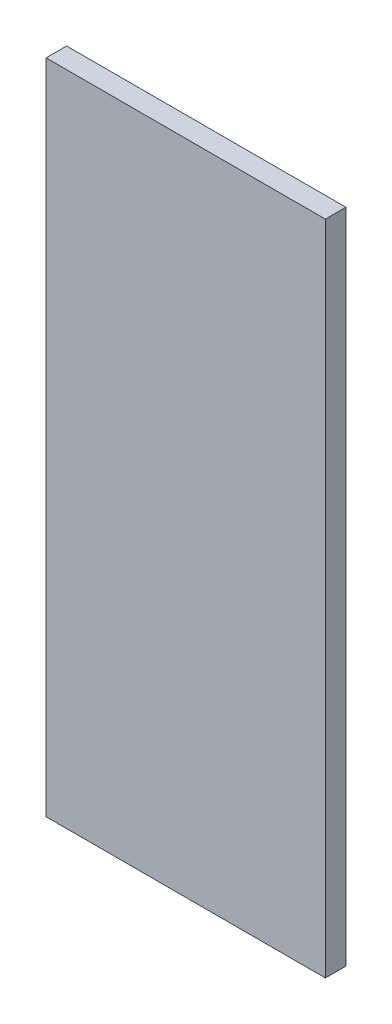
ISO-10303-21;
HEADER;
FILE_DESCRIPTION(('STEP AP214'),'2;1');
FILE_NAME('part.step','',(''),(''),'','','');
FILE_SCHEMA(('AUTOMOTIVE_DESIGN { 1 0 10303 214 1 1 1 1 }'));
ENDSEC;
DATA;
#1=APPLICATION_CONTEXT('core data for automotive mechanical design processes');
#2=APPLICATION_PROTOCOL_DEFINITION('international standard','automotive_design',2000,#1);
#3=PRODUCT_CONTEXT('',#1,'mechanical');
#4=PRODUCT('Part','Part','',(#3));
#5=PRODUCT_RELATED_PRODUCT_CATEGORY('part','',(#4));
#6=PRODUCT_DEFINITION_FORMATION('','',#4);
#7=PRODUCT_DEFINITION_CONTEXT('part definition',#1,'design');
#8=PRODUCT_DEFINITION('design','',#6,#7);
#9=PRODUCT_DEFINITION_SHAPE('','',#8);
#10=(LENGTH_UNIT() NAMED_UNIT(*) SI_UNIT(.MILLI.,.METRE.));
#11=(NAMED_UNIT(*) PLANE_ANGLE_UNIT() SI_UNIT($,.RADIAN.));
#12=(NAMED_UNIT(*) SI_UNIT($,.STERADIAN.) SOLID_ANGLE_UNIT());
#13=UNCERTAINTY_MEASURE_WITH_UNIT(LENGTH_MEASURE(1.E-05),#10,'distance_accuracy_value','');
#14=(GEOMETRIC_REPRESENTATION_CONTEXT(3) GLOBAL_UNCERTAINTY_ASSIGNED_CONTEXT((#13)) GLOBAL_UNIT_ASSIGNED_CONTEXT((#10,
#11,#12)) REPRESENTATION_CONTEXT('',''));
#15=CARTESIAN_POINT('',(0.,0.,0.));
#16=DIRECTION('',(0.,0.,1.));
#17=DIRECTION('',(1.,0.,0.));
#18=AXIS2_PLACEMENT_3D('',#15,#16,#17);
#19=CARTESIAN_POINT('',(10.795,25.4,1.5875));
#20=DIRECTION('',(-1.,0.,0.));
#21=DIRECTION('',(0.,-1.,0.));
#22=AXIS2_PLACEMENT_3D('',#19,#20,#21);
#23=PLANE('',#22);
#24=DIRECTION('',(0.,1.,0.));
#25=VECTOR('',#24,1.);
#26=CARTESIAN_POINT('',(10.795,25.4,0.));
#27=LINE('',#26,#25);
#28=CARTESIAN_POINT('',(10.795,-25.4,0.));
#29=VERTEX_POINT('',#28);
#30=CARTESIAN_POINT('',(10.795,25.4,0.));
#31=VERTEX_POINT('',#30);
#32=EDGE_CURVE('E102',#29,#31,#27,.T.);
#33=ORIENTED_EDGE('',*,*,#32,.T.);
#34=DIRECTION('',(0.,0.,-1.));
#35=VECTOR('',#34,1.);
#36=CARTESIAN_POINT('',(10.795,25.4,1.5875));
#37=LINE('',#36,#35);
#38=CARTESIAN_POINT('',(10.795,25.4,1.5875));
#39=VERTEX_POINT('',#38);
#40=EDGE_CURVE('E11',#39,#31,#37,.T.);
#41=ORIENTED_EDGE('',*,*,#40,.F.);
#42=DIRECTION('',(0.,1.,0.));
#43=VECTOR('',#42,1.);
#44=CARTESIAN_POINT('',(10.795,25.4,1.5875));
#45=LINE('',#44,#43);
#46=CARTESIAN_POINT('',(10.795,-25.4,1.5875));
#47=VERTEX_POINT('',#46);
#48=EDGE_CURVE('E90',#47,#39,#45,.T.);
#49=ORIENTED_EDGE('',*,*,#48,.F.);
#50=DIRECTION('',(0.,0.,-1.));
#51=VECTOR('',#50,1.);
#52=CARTESIAN_POINT('',(10.795,-25.4,1.5875));
#53=LINE('',#52,#51);
#54=EDGE_CURVE('E98',#47,#29,#53,.T.);
#55=ORIENTED_EDGE('',*,*,#54,.T.);
#56=EDGE_LOOP('',(#33,#41,#49,#55));
#57=FACE_BOUND('',#56,.T.);
#58=ADVANCED_FACE('F39',(#57),#23,.F.);
#59=CARTESIAN_POINT('',(-10.795,25.4,1.5875));
#60=DIRECTION('',(0.,-1.,0.));
#61=DIRECTION('',(0.,0.,-1.));
#62=AXIS2_PLACEMENT_3D('',#59,#60,#61);
#63=PLANE('',#62);
#64=DIRECTION('',(-1.,0.,0.));
#65=VECTOR('',#64,1.);
#66=CARTESIAN_POINT('',(-10.795,25.4,0.));
#67=LINE('',#66,#65);
#68=CARTESIAN_POINT('',(-10.795,25.4,0.));
#69=VERTEX_POINT('',#68);
#70=EDGE_CURVE('E94',#31,#69,#67,.T.);
#71=ORIENTED_EDGE('',*,*,#70,.T.);
#72=DIRECTION('',(0.,0.,-1.));
#73=VECTOR('',#72,1.);
#74=CARTESIAN_POINT('',(-10.795,25.4,1.5875));
#75=LINE('',#74,#73);
#76=CARTESIAN_POINT('',(-10.795,25.4,1.5875));
#77=VERTEX_POINT('',#76);
#78=EDGE_CURVE('E47',#77,#69,#75,.T.);
#79=ORIENTED_EDGE('',*,*,#78,.F.);
#80=DIRECTION('',(-1.,0.,0.));
#81=VECTOR('',#80,1.);
#82=CARTESIAN_POINT('',(-10.795,25.4,1.5875));
#83=LINE('',#82,#81);
#84=EDGE_CURVE('E85',#39,#77,#83,.T.);
#85=ORIENTED_EDGE('',*,*,#84,.F.);
#86=ORIENTED_EDGE('',*,*,#40,.T.);
#87=EDGE_LOOP('',(#71,#79,#85,#86));
#88=FACE_BOUND('',#87,.T.);
#89=ADVANCED_FACE('F93',(#88),#63,.F.);
#90=CARTESIAN_POINT('',(-10.795,25.4,1.5875));
#91=DIRECTION('',(1.,0.,0.));
#92=DIRECTION('',(0.,1.,0.));
#93=AXIS2_PLACEMENT_3D('',#90,#91,#92);
#94=PLANE('',#93);
#95=DIRECTION('',(0.,-1.,0.));
#96=VECTOR('',#95,1.);
#97=CARTESIAN_POINT('',(-10.795,25.4,0.));
#98=LINE('',#97,#96);
#99=CARTESIAN_POINT('',(-10.795,-25.4,0.));
#100=VERTEX_POINT('',#99);
#101=EDGE_CURVE('E72',#69,#100,#98,.T.);
#102=ORIENTED_EDGE('',*,*,#101,.T.);
#103=DIRECTION('',(0.,0.,-1.));
#104=VECTOR('',#103,1.);
#105=CARTESIAN_POINT('',(-10.795,-25.4,1.5875));
#106=LINE('',#105,#104);
#107=CARTESIAN_POINT('',(-10.795,-25.4,1.5875));
#108=VERTEX_POINT('',#107);
#109=EDGE_CURVE('E95',#108,#100,#106,.T.);
#110=ORIENTED_EDGE('',*,*,#109,.F.);
#111=DIRECTION('',(0.,-1.,0.));
#112=VECTOR('',#111,1.);
#113=CARTESIAN_POINT('',(-10.795,25.4,1.5875));
#114=LINE('',#113,#112);
#115=EDGE_CURVE('E88',#77,#108,#114,.T.);
#116=ORIENTED_EDGE('',*,*,#115,.F.);
#117=ORIENTED_EDGE('',*,*,#78,.T.);
#118=EDGE_LOOP('',(#102,#110,#116,#117));
#119=FACE_BOUND('',#118,.T.);
#120=ADVANCED_FACE('F96',(#119),#94,.F.);
#121=CARTESIAN_POINT('',(-10.795,-25.4,1.5875));
#122=DIRECTION('',(0.,1.,0.));
#123=DIRECTION('',(0.,0.,1.));
#124=AXIS2_PLACEMENT_3D('',#121,#122,#123);
#125=PLANE('',#124);
#126=DIRECTION('',(1.,0.,0.));
#127=VECTOR('',#126,1.);
#128=CARTESIAN_POINT('',(-10.795,-25.4,0.));
#129=LINE('',#128,#127);
#130=EDGE_CURVE('E78',#100,#29,#129,.T.);
#131=ORIENTED_EDGE('',*,*,#130,.T.);
#132=ORIENTED_EDGE('',*,*,#54,.F.);
#133=DIRECTION('',(1.,0.,0.));
#134=VECTOR('',#133,1.);
#135=CARTESIAN_POINT('',(-10.795,-25.4,1.5875));
#136=LINE('',#135,#134);
#137=EDGE_CURVE('E55',#108,#47,#136,.T.);
#138=ORIENTED_EDGE('',*,*,#137,.F.);
#139=ORIENTED_EDGE('',*,*,#109,.T.);
#140=EDGE_LOOP('',(#131,#132,#138,#139));
#141=FACE_BOUND('',#140,.T.);
#142=ADVANCED_FACE('F109',(#141),#125,.F.);
#143=CARTESIAN_POINT('',(0.,0.,1.5875));
#144=DIRECTION('',(0.,0.,1.));
#145=DIRECTION('',(1.,0.,0.));
#146=AXIS2_PLACEMENT_3D('',#143,#144,#145);
#147=PLANE('',#146);
#148=ORIENTED_EDGE('',*,*,#48,.T.);
#149=ORIENTED_EDGE('',*,*,#84,.T.);
#150=ORIENTED_EDGE('',*,*,#115,.T.);
#151=ORIENTED_EDGE('',*,*,#137,.T.);
#152=EDGE_LOOP('',(#148,#149,#150,#151));
#153=FACE_BOUND('',#152,.T.);
#154=ADVANCED_FACE('F86',(#153),#147,.T.);
#155=CARTESIAN_POINT('',(0.,0.,0.));
#156=DIRECTION('',(0.,0.,1.));
#157=DIRECTION('',(1.,0.,0.));
#158=AXIS2_PLACEMENT_3D('',#155,#156,#157);
#159=PLANE('',#158);
#160=ORIENTED_EDGE('',*,*,#32,.F.);
#161=ORIENTED_EDGE('',*,*,#130,.F.);
#162=ORIENTED_EDGE('',*,*,#101,.F.);
#163=ORIENTED_EDGE('',*,*,#70,.F.);
#164=EDGE_LOOP('',(#160,#161,#162,#163));
#165=FACE_BOUND('',#164,.T.);
#166=ADVANCED_FACE('F112',(#165),#159,.F.);
#167=CLOSED_SHELL('',(#58,#89,#120,#142,#154,#166));
#168=MANIFOLD_SOLID_BREP('B2',#167);
#169=ADVANCED_BREP_SHAPE_REPRESENTATION('',(#18,#168),#14);
#170=SHAPE_DEFINITION_REPRESENTATION(#9,#169);
ENDSEC;
END-ISO-10303-21;
